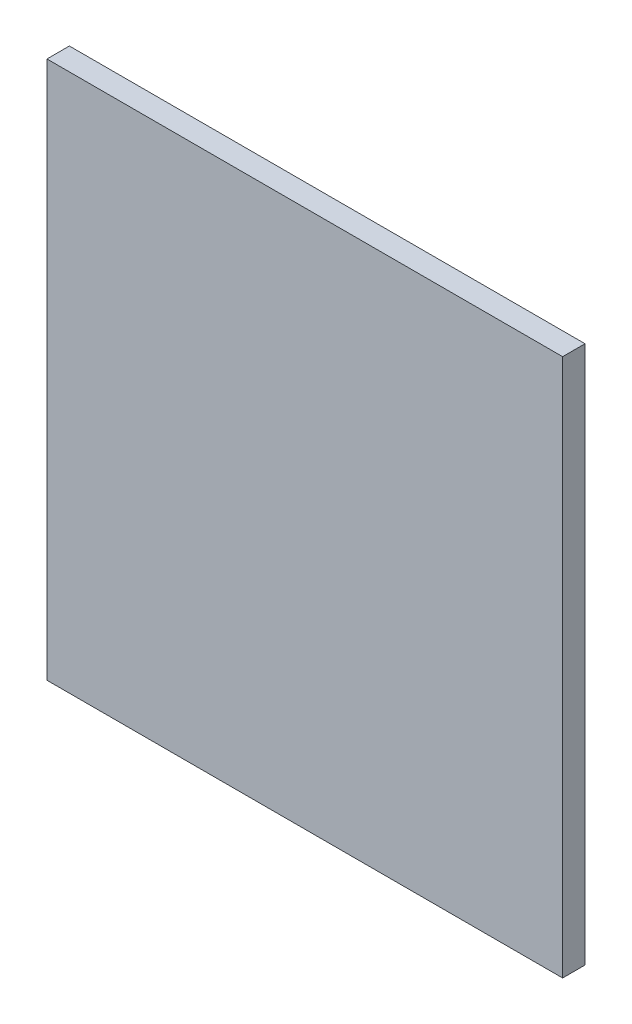
ISO-10303-21;
HEADER;
FILE_DESCRIPTION(('STEP AP214'),'2;1');
FILE_NAME('part.step','',(''),(''),'','','');
FILE_SCHEMA(('AUTOMOTIVE_DESIGN { 1 0 10303 214 1 1 1 1 }'));
ENDSEC;
DATA;
#1=APPLICATION_CONTEXT('core data for automotive mechanical design processes');
#2=APPLICATION_PROTOCOL_DEFINITION('international standard','automotive_design',2000,#1);
#3=PRODUCT_CONTEXT('',#1,'mechanical');
#4=PRODUCT('Part','Part','',(#3));
#5=PRODUCT_RELATED_PRODUCT_CATEGORY('part','',(#4));
#6=PRODUCT_DEFINITION_FORMATION('','',#4);
#7=PRODUCT_DEFINITION_CONTEXT('part definition',#1,'design');
#8=PRODUCT_DEFINITION('design','',#6,#7);
#9=PRODUCT_DEFINITION_SHAPE('','',#8);
#10=(LENGTH_UNIT() NAMED_UNIT(*) SI_UNIT(.MILLI.,.METRE.));
#11=(NAMED_UNIT(*) PLANE_ANGLE_UNIT() SI_UNIT($,.RADIAN.));
#12=(NAMED_UNIT(*) SI_UNIT($,.STERADIAN.) SOLID_ANGLE_UNIT());
#13=UNCERTAINTY_MEASURE_WITH_UNIT(LENGTH_MEASURE(1.E-05),#10,'distance_accuracy_value','');
#14=(GEOMETRIC_REPRESENTATION_CONTEXT(3) GLOBAL_UNCERTAINTY_ASSIGNED_CONTEXT((#13)) GLOBAL_UNIT_ASSIGNED_CONTEXT((#10,
#11,#12)) REPRESENTATION_CONTEXT('',''));
#15=CARTESIAN_POINT('',(0.,0.,0.));
#16=DIRECTION('',(0.,0.,1.));
#17=DIRECTION('',(1.,0.,0.));
#18=AXIS2_PLACEMENT_3D('',#15,#16,#17);
#19=CARTESIAN_POINT('',(-57.5,120.,5.));
#20=DIRECTION('',(1.,0.,0.));
#21=DIRECTION('',(0.,1.,0.));
#22=AXIS2_PLACEMENT_3D('',#19,#20,#21);
#23=PLANE('',#22);
#24=DIRECTION('',(0.,-1.,0.));
#25=VECTOR('',#24,1.);
#26=CARTESIAN_POINT('',(-57.5,120.,0.));
#27=LINE('',#26,#25);
#28=CARTESIAN_POINT('',(-57.5,120.,0.));
#29=VERTEX_POINT('',#28);
#30=CARTESIAN_POINT('',(-57.5,0.,0.));
#31=VERTEX_POINT('',#30);
#32=EDGE_CURVE('E100',#29,#31,#27,.T.);
#33=ORIENTED_EDGE('',*,*,#32,.T.);
#34=DIRECTION('',(0.,0.,-1.));
#35=VECTOR('',#34,1.);
#36=CARTESIAN_POINT('',(-57.5,0.,5.));
#37=LINE('',#36,#35);
#38=CARTESIAN_POINT('',(-57.5,0.,5.));
#39=VERTEX_POINT('',#38);
#40=EDGE_CURVE('E11',#39,#31,#37,.T.);
#41=ORIENTED_EDGE('',*,*,#40,.F.);
#42=DIRECTION('',(0.,-1.,0.));
#43=VECTOR('',#42,1.);
#44=CARTESIAN_POINT('',(-57.5,120.,5.));
#45=LINE('',#44,#43);
#46=CARTESIAN_POINT('',(-57.5,120.,5.));
#47=VERTEX_POINT('',#46);
#48=EDGE_CURVE('E88',#47,#39,#45,.T.);
#49=ORIENTED_EDGE('',*,*,#48,.F.);
#50=DIRECTION('',(0.,0.,-1.));
#51=VECTOR('',#50,1.);
#52=CARTESIAN_POINT('',(-57.5,120.,5.));
#53=LINE('',#52,#51);
#54=EDGE_CURVE('E96',#47,#29,#53,.T.);
#55=ORIENTED_EDGE('',*,*,#54,.T.);
#56=EDGE_LOOP('',(#33,#41,#49,#55));
#57=FACE_BOUND('',#56,.T.);
#58=ADVANCED_FACE('F37',(#57),#23,.F.);
#59=CARTESIAN_POINT('',(-57.5,0.,5.));
#60=DIRECTION('',(0.,1.,0.));
#61=DIRECTION('',(-1.,0.,0.));
#62=AXIS2_PLACEMENT_3D('',#59,#60,#61);
#63=PLANE('',#62);
#64=DIRECTION('',(1.,0.,0.));
#65=VECTOR('',#64,1.);
#66=CARTESIAN_POINT('',(-57.5,0.,0.));
#67=LINE('',#66,#65);
#68=CARTESIAN_POINT('',(57.5,0.,0.));
#69=VERTEX_POINT('',#68);
#70=EDGE_CURVE('E92',#31,#69,#67,.T.);
#71=ORIENTED_EDGE('',*,*,#70,.T.);
#72=DIRECTION('',(0.,0.,-1.));
#73=VECTOR('',#72,1.);
#74=CARTESIAN_POINT('',(57.5,0.,5.));
#75=LINE('',#74,#73);
#76=CARTESIAN_POINT('',(57.5,0.,5.));
#77=VERTEX_POINT('',#76);
#78=EDGE_CURVE('E45',#77,#69,#75,.T.);
#79=ORIENTED_EDGE('',*,*,#78,.F.);
#80=DIRECTION('',(1.,0.,0.));
#81=VECTOR('',#80,1.);
#82=CARTESIAN_POINT('',(-57.5,0.,5.));
#83=LINE('',#82,#81);
#84=EDGE_CURVE('E83',#39,#77,#83,.T.);
#85=ORIENTED_EDGE('',*,*,#84,.F.);
#86=ORIENTED_EDGE('',*,*,#40,.T.);
#87=EDGE_LOOP('',(#71,#79,#85,#86));
#88=FACE_BOUND('',#87,.T.);
#89=ADVANCED_FACE('F91',(#88),#63,.F.);
#90=CARTESIAN_POINT('',(57.5,120.,5.));
#91=DIRECTION('',(-1.,0.,0.));
#92=DIRECTION('',(0.,-1.,0.));
#93=AXIS2_PLACEMENT_3D('',#90,#91,#92);
#94=PLANE('',#93);
#95=DIRECTION('',(0.,1.,0.));
#96=VECTOR('',#95,1.);
#97=CARTESIAN_POINT('',(57.5,120.,0.));
#98=LINE('',#97,#96);
#99=CARTESIAN_POINT('',(57.5,120.,0.));
#100=VERTEX_POINT('',#99);
#101=EDGE_CURVE('E70',#69,#100,#98,.T.);
#102=ORIENTED_EDGE('',*,*,#101,.T.);
#103=DIRECTION('',(0.,0.,-1.));
#104=VECTOR('',#103,1.);
#105=CARTESIAN_POINT('',(57.5,120.,5.));
#106=LINE('',#105,#104);
#107=CARTESIAN_POINT('',(57.5,120.,5.));
#108=VERTEX_POINT('',#107);
#109=EDGE_CURVE('E93',#108,#100,#106,.T.);
#110=ORIENTED_EDGE('',*,*,#109,.F.);
#111=DIRECTION('',(0.,1.,0.));
#112=VECTOR('',#111,1.);
#113=CARTESIAN_POINT('',(57.5,120.,5.));
#114=LINE('',#113,#112);
#115=EDGE_CURVE('E86',#77,#108,#114,.T.);
#116=ORIENTED_EDGE('',*,*,#115,.F.);
#117=ORIENTED_EDGE('',*,*,#78,.T.);
#118=EDGE_LOOP('',(#102,#110,#116,#117));
#119=FACE_BOUND('',#118,.T.);
#120=ADVANCED_FACE('F94',(#119),#94,.F.);
#121=CARTESIAN_POINT('',(-57.5,120.,5.));
#122=DIRECTION('',(0.,-1.,0.));
#123=DIRECTION('',(1.,0.,0.));
#124=AXIS2_PLACEMENT_3D('',#121,#122,#123);
#125=PLANE('',#124);
#126=DIRECTION('',(-1.,0.,0.));
#127=VECTOR('',#126,1.);
#128=CARTESIAN_POINT('',(-57.5,120.,0.));
#129=LINE('',#128,#127);
#130=EDGE_CURVE('E76',#100,#29,#129,.T.);
#131=ORIENTED_EDGE('',*,*,#130,.T.);
#132=ORIENTED_EDGE('',*,*,#54,.F.);
#133=DIRECTION('',(-1.,0.,0.));
#134=VECTOR('',#133,1.);
#135=CARTESIAN_POINT('',(-57.5,120.,5.));
#136=LINE('',#135,#134);
#137=EDGE_CURVE('E53',#108,#47,#136,.T.);
#138=ORIENTED_EDGE('',*,*,#137,.F.);
#139=ORIENTED_EDGE('',*,*,#109,.T.);
#140=EDGE_LOOP('',(#131,#132,#138,#139));
#141=FACE_BOUND('',#140,.T.);
#142=ADVANCED_FACE('F107',(#141),#125,.F.);
#143=CARTESIAN_POINT('',(0.,0.,5.));
#144=DIRECTION('',(0.,0.,1.));
#145=DIRECTION('',(1.,0.,0.));
#146=AXIS2_PLACEMENT_3D('',#143,#144,#145);
#147=PLANE('',#146);
#148=ORIENTED_EDGE('',*,*,#48,.T.);
#149=ORIENTED_EDGE('',*,*,#84,.T.);
#150=ORIENTED_EDGE('',*,*,#115,.T.);
#151=ORIENTED_EDGE('',*,*,#137,.T.);
#152=EDGE_LOOP('',(#148,#149,#150,#151));
#153=FACE_BOUND('',#152,.T.);
#154=ADVANCED_FACE('F84',(#153),#147,.T.);
#155=CARTESIAN_POINT('',(0.,0.,0.));
#156=DIRECTION('',(0.,0.,1.));
#157=DIRECTION('',(1.,0.,0.));
#158=AXIS2_PLACEMENT_3D('',#155,#156,#157);
#159=PLANE('',#158);
#160=ORIENTED_EDGE('',*,*,#32,.F.);
#161=ORIENTED_EDGE('',*,*,#130,.F.);
#162=ORIENTED_EDGE('',*,*,#101,.F.);
#163=ORIENTED_EDGE('',*,*,#70,.F.);
#164=EDGE_LOOP('',(#160,#161,#162,#163));
#165=FACE_BOUND('',#164,.T.);
#166=ADVANCED_FACE('F110',(#165),#159,.F.);
#167=CLOSED_SHELL('',(#58,#89,#120,#142,#154,#166));
#168=MANIFOLD_SOLID_BREP('B2',#167);
#169=ADVANCED_BREP_SHAPE_REPRESENTATION('',(#18,#168),#14);
#170=SHAPE_DEFINITION_REPRESENTATION(#9,#169);
ENDSEC;
END-ISO-10303-21;
